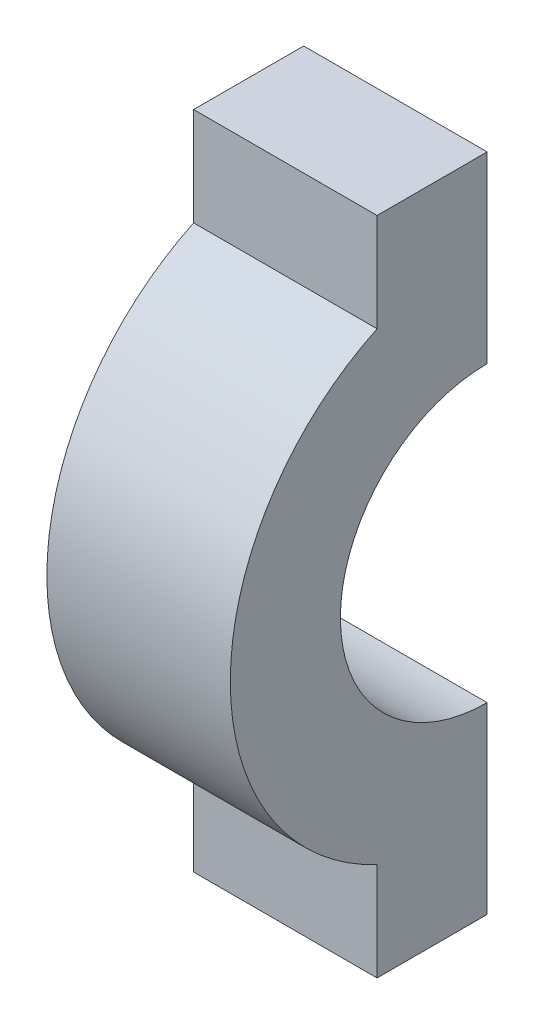
ISO-10303-21;
HEADER;
FILE_DESCRIPTION(('STEP AP214'),'2;1');
FILE_NAME('part.step','',(''),(''),'','','');
FILE_SCHEMA(('AUTOMOTIVE_DESIGN { 1 0 10303 214 1 1 1 1 }'));
ENDSEC;
DATA;
#1=APPLICATION_CONTEXT('core data for automotive mechanical design processes');
#2=APPLICATION_PROTOCOL_DEFINITION('international standard','automotive_design',2000,#1);
#3=PRODUCT_CONTEXT('',#1,'mechanical');
#4=PRODUCT('Part','Part','',(#3));
#5=PRODUCT_RELATED_PRODUCT_CATEGORY('part','',(#4));
#6=PRODUCT_DEFINITION_FORMATION('','',#4);
#7=PRODUCT_DEFINITION_CONTEXT('part definition',#1,'design');
#8=PRODUCT_DEFINITION('design','',#6,#7);
#9=PRODUCT_DEFINITION_SHAPE('','',#8);
#10=(LENGTH_UNIT() NAMED_UNIT(*) SI_UNIT(.MILLI.,.METRE.));
#11=(NAMED_UNIT(*) PLANE_ANGLE_UNIT() SI_UNIT($,.RADIAN.));
#12=(NAMED_UNIT(*) SI_UNIT($,.STERADIAN.) SOLID_ANGLE_UNIT());
#13=UNCERTAINTY_MEASURE_WITH_UNIT(LENGTH_MEASURE(1.E-05),#10,'distance_accuracy_value','');
#14=(GEOMETRIC_REPRESENTATION_CONTEXT(3) GLOBAL_UNCERTAINTY_ASSIGNED_CONTEXT((#13)) GLOBAL_UNIT_ASSIGNED_CONTEXT((#10,
#11,#12)) REPRESENTATION_CONTEXT('',''));
#15=CARTESIAN_POINT('',(0.,0.,0.));
#16=DIRECTION('',(0.,0.,1.));
#17=DIRECTION('',(1.,0.,0.));
#18=AXIS2_PLACEMENT_3D('',#15,#16,#17);
#19=CARTESIAN_POINT('',(15.,72.,18.));
#20=DIRECTION('',(-1.,0.,0.));
#21=DIRECTION('',(0.,0.,1.));
#22=AXIS2_PLACEMENT_3D('',#19,#20,#21);
#23=CYLINDRICAL_SURFACE('',#22,14.);
#24=CARTESIAN_POINT('',(5.,72.,18.));
#25=DIRECTION('',(1.,0.,0.));
#26=DIRECTION('',(0.,0.,-1.));
#27=AXIS2_PLACEMENT_3D('',#24,#25,#26);
#28=CIRCLE('',#27,14.);
#29=CARTESIAN_POINT('',(5.,84.6491106406735,24.));
#30=VERTEX_POINT('',#29);
#31=CARTESIAN_POINT('',(5.,59.3508893593265,24.));
#32=VERTEX_POINT('',#31);
#33=EDGE_CURVE('E131',#30,#32,#28,.T.);
#34=ORIENTED_EDGE('',*,*,#33,.T.);
#35=DIRECTION('',(-1.,0.,0.));
#36=VECTOR('',#35,1.);
#37=CARTESIAN_POINT('',(15.,59.3508893593265,24.));
#38=LINE('',#37,#36);
#39=CARTESIAN_POINT('',(15.,59.3508893593265,24.));
#40=VERTEX_POINT('',#39);
#41=EDGE_CURVE('E11',#40,#32,#38,.T.);
#42=ORIENTED_EDGE('',*,*,#41,.F.);
#43=CARTESIAN_POINT('',(15.,72.,18.));
#44=DIRECTION('',(1.,0.,0.));
#45=DIRECTION('',(0.,0.,-1.));
#46=AXIS2_PLACEMENT_3D('',#43,#44,#45);
#47=CIRCLE('',#46,14.);
#48=CARTESIAN_POINT('',(15.,84.6491106406735,24.));
#49=VERTEX_POINT('',#48);
#50=EDGE_CURVE('E145',#49,#40,#47,.T.);
#51=ORIENTED_EDGE('',*,*,#50,.F.);
#52=DIRECTION('',(-1.,0.,0.));
#53=VECTOR('',#52,1.);
#54=CARTESIAN_POINT('',(15.,84.6491106406735,24.));
#55=LINE('',#54,#53);
#56=EDGE_CURVE('E127',#49,#30,#55,.T.);
#57=ORIENTED_EDGE('',*,*,#56,.T.);
#58=EDGE_LOOP('',(#34,#42,#51,#57));
#59=FACE_BOUND('',#58,.T.);
#60=ADVANCED_FACE('F35',(#59),#23,.T.);
#61=CARTESIAN_POINT('',(15.,54.,24.));
#62=DIRECTION('',(0.,0.,-1.));
#63=DIRECTION('',(-1.,0.,0.));
#64=AXIS2_PLACEMENT_3D('',#61,#62,#63);
#65=PLANE('',#64);
#66=DIRECTION('',(0.,-1.,0.));
#67=VECTOR('',#66,1.);
#68=CARTESIAN_POINT('',(5.,54.,24.));
#69=LINE('',#68,#67);
#70=CARTESIAN_POINT('',(5.,54.,24.));
#71=VERTEX_POINT('',#70);
#72=EDGE_CURVE('E134',#32,#71,#69,.T.);
#73=ORIENTED_EDGE('',*,*,#72,.T.);
#74=DIRECTION('',(-1.,0.,0.));
#75=VECTOR('',#74,1.);
#76=CARTESIAN_POINT('',(15.,54.,24.));
#77=LINE('',#76,#75);
#78=CARTESIAN_POINT('',(15.,54.,24.));
#79=VERTEX_POINT('',#78);
#80=EDGE_CURVE('E43',#79,#71,#77,.T.);
#81=ORIENTED_EDGE('',*,*,#80,.F.);
#82=DIRECTION('',(0.,-1.,0.));
#83=VECTOR('',#82,1.);
#84=CARTESIAN_POINT('',(15.,54.,24.));
#85=LINE('',#84,#83);
#86=EDGE_CURVE('E94',#40,#79,#85,.T.);
#87=ORIENTED_EDGE('',*,*,#86,.F.);
#88=ORIENTED_EDGE('',*,*,#41,.T.);
#89=EDGE_LOOP('',(#73,#81,#87,#88));
#90=FACE_BOUND('',#89,.T.);
#91=ADVANCED_FACE('F180',(#90),#65,.F.);
#92=CARTESIAN_POINT('',(15.,54.,18.));
#93=DIRECTION('',(0.,1.,0.));
#94=DIRECTION('',(0.,0.,1.));
#95=AXIS2_PLACEMENT_3D('',#92,#93,#94);
#96=PLANE('',#95);
#97=DIRECTION('',(0.,0.,-1.));
#98=VECTOR('',#97,1.);
#99=CARTESIAN_POINT('',(5.,54.,18.));
#100=LINE('',#99,#98);
#101=CARTESIAN_POINT('',(5.,54.,18.));
#102=VERTEX_POINT('',#101);
#103=EDGE_CURVE('E136',#71,#102,#100,.T.);
#104=ORIENTED_EDGE('',*,*,#103,.T.);
#105=DIRECTION('',(-1.,0.,0.));
#106=VECTOR('',#105,1.);
#107=CARTESIAN_POINT('',(15.,54.,18.));
#108=LINE('',#107,#106);
#109=CARTESIAN_POINT('',(15.,54.,18.));
#110=VERTEX_POINT('',#109);
#111=EDGE_CURVE('E152',#110,#102,#108,.T.);
#112=ORIENTED_EDGE('',*,*,#111,.F.);
#113=DIRECTION('',(0.,0.,-1.));
#114=VECTOR('',#113,1.);
#115=CARTESIAN_POINT('',(15.,54.,18.));
#116=LINE('',#115,#114);
#117=EDGE_CURVE('E160',#79,#110,#116,.T.);
#118=ORIENTED_EDGE('',*,*,#117,.F.);
#119=ORIENTED_EDGE('',*,*,#80,.T.);
#120=EDGE_LOOP('',(#104,#112,#118,#119));
#121=FACE_BOUND('',#120,.T.);
#122=ADVANCED_FACE('F158',(#121),#96,.F.);
#123=CARTESIAN_POINT('',(15.,64.,18.));
#124=DIRECTION('',(0.,0.,1.));
#125=DIRECTION('',(0.,-1.,0.));
#126=AXIS2_PLACEMENT_3D('',#123,#124,#125);
#127=PLANE('',#126);
#128=DIRECTION('',(0.,1.,0.));
#129=VECTOR('',#128,1.);
#130=CARTESIAN_POINT('',(5.,64.,18.));
#131=LINE('',#130,#129);
#132=CARTESIAN_POINT('',(5.,64.,18.));
#133=VERTEX_POINT('',#132);
#134=EDGE_CURVE('E138',#102,#133,#131,.T.);
#135=ORIENTED_EDGE('',*,*,#134,.T.);
#136=DIRECTION('',(-1.,0.,0.));
#137=VECTOR('',#136,1.);
#138=CARTESIAN_POINT('',(15.,64.,18.));
#139=LINE('',#138,#137);
#140=CARTESIAN_POINT('',(15.,64.,18.));
#141=VERTEX_POINT('',#140);
#142=EDGE_CURVE('E149',#141,#133,#139,.T.);
#143=ORIENTED_EDGE('',*,*,#142,.F.);
#144=DIRECTION('',(0.,1.,0.));
#145=VECTOR('',#144,1.);
#146=CARTESIAN_POINT('',(15.,64.,18.));
#147=LINE('',#146,#145);
#148=EDGE_CURVE('E172',#110,#141,#147,.T.);
#149=ORIENTED_EDGE('',*,*,#148,.F.);
#150=ORIENTED_EDGE('',*,*,#111,.T.);
#151=EDGE_LOOP('',(#135,#143,#149,#150));
#152=FACE_BOUND('',#151,.T.);
#153=ADVANCED_FACE('F168',(#152),#127,.F.);
#154=CARTESIAN_POINT('',(15.,72.,18.));
#155=DIRECTION('',(-1.,0.,0.));
#156=DIRECTION('',(0.,0.,1.));
#157=AXIS2_PLACEMENT_3D('',#154,#155,#156);
#158=CYLINDRICAL_SURFACE('',#157,8.00000000000001);
#159=CARTESIAN_POINT('',(5.,72.,18.));
#160=DIRECTION('',(-1.,0.,0.));
#161=DIRECTION('',(0.,0.,-1.));
#162=AXIS2_PLACEMENT_3D('',#159,#160,#161);
#163=CIRCLE('',#162,8.00000000000001);
#164=CARTESIAN_POINT('',(5.,80.,18.));
#165=VERTEX_POINT('',#164);
#166=EDGE_CURVE('E140',#133,#165,#163,.T.);
#167=ORIENTED_EDGE('',*,*,#166,.T.);
#168=DIRECTION('',(-1.,0.,0.));
#169=VECTOR('',#168,1.);
#170=CARTESIAN_POINT('',(15.,80.,18.));
#171=LINE('',#170,#169);
#172=CARTESIAN_POINT('',(15.,80.,18.));
#173=VERTEX_POINT('',#172);
#174=EDGE_CURVE('E122',#173,#165,#171,.T.);
#175=ORIENTED_EDGE('',*,*,#174,.F.);
#176=CARTESIAN_POINT('',(15.,72.,18.));
#177=DIRECTION('',(-1.,0.,0.));
#178=DIRECTION('',(0.,0.,-1.));
#179=AXIS2_PLACEMENT_3D('',#176,#177,#178);
#180=CIRCLE('',#179,8.00000000000001);
#181=EDGE_CURVE('E113',#141,#173,#180,.T.);
#182=ORIENTED_EDGE('',*,*,#181,.F.);
#183=ORIENTED_EDGE('',*,*,#142,.T.);
#184=EDGE_LOOP('',(#167,#175,#182,#183));
#185=FACE_BOUND('',#184,.T.);
#186=ADVANCED_FACE('F171',(#185),#158,.F.);
#187=CARTESIAN_POINT('',(15.,80.,18.));
#188=DIRECTION('',(0.,0.,1.));
#189=DIRECTION('',(1.,0.,0.));
#190=AXIS2_PLACEMENT_3D('',#187,#188,#189);
#191=PLANE('',#190);
#192=DIRECTION('',(0.,1.,0.));
#193=VECTOR('',#192,1.);
#194=CARTESIAN_POINT('',(5.,80.,18.));
#195=LINE('',#194,#193);
#196=CARTESIAN_POINT('',(5.,90.,18.));
#197=VERTEX_POINT('',#196);
#198=EDGE_CURVE('E121',#165,#197,#195,.T.);
#199=ORIENTED_EDGE('',*,*,#198,.T.);
#200=DIRECTION('',(-1.,0.,0.));
#201=VECTOR('',#200,1.);
#202=CARTESIAN_POINT('',(15.,90.,18.));
#203=LINE('',#202,#201);
#204=CARTESIAN_POINT('',(15.,90.,18.));
#205=VERTEX_POINT('',#204);
#206=EDGE_CURVE('E118',#205,#197,#203,.T.);
#207=ORIENTED_EDGE('',*,*,#206,.F.);
#208=DIRECTION('',(0.,1.,0.));
#209=VECTOR('',#208,1.);
#210=CARTESIAN_POINT('',(15.,80.,18.));
#211=LINE('',#210,#209);
#212=EDGE_CURVE('E107',#173,#205,#211,.T.);
#213=ORIENTED_EDGE('',*,*,#212,.F.);
#214=ORIENTED_EDGE('',*,*,#174,.T.);
#215=EDGE_LOOP('',(#199,#207,#213,#214));
#216=FACE_BOUND('',#215,.T.);
#217=ADVANCED_FACE('F119',(#216),#191,.F.);
#218=CARTESIAN_POINT('',(15.,90.,18.));
#219=DIRECTION('',(0.,-1.,0.));
#220=DIRECTION('',(0.,0.,-1.));
#221=AXIS2_PLACEMENT_3D('',#218,#219,#220);
#222=PLANE('',#221);
#223=DIRECTION('',(0.,0.,1.));
#224=VECTOR('',#223,1.);
#225=CARTESIAN_POINT('',(5.,90.,18.));
#226=LINE('',#225,#224);
#227=CARTESIAN_POINT('',(5.,90.,24.));
#228=VERTEX_POINT('',#227);
#229=EDGE_CURVE('E80',#197,#228,#226,.T.);
#230=ORIENTED_EDGE('',*,*,#229,.T.);
#231=DIRECTION('',(-1.,0.,0.));
#232=VECTOR('',#231,1.);
#233=CARTESIAN_POINT('',(15.,90.,24.));
#234=LINE('',#233,#232);
#235=CARTESIAN_POINT('',(15.,90.,24.));
#236=VERTEX_POINT('',#235);
#237=EDGE_CURVE('E123',#236,#228,#234,.T.);
#238=ORIENTED_EDGE('',*,*,#237,.F.);
#239=DIRECTION('',(0.,0.,1.));
#240=VECTOR('',#239,1.);
#241=CARTESIAN_POINT('',(15.,90.,18.));
#242=LINE('',#241,#240);
#243=EDGE_CURVE('E111',#205,#236,#242,.T.);
#244=ORIENTED_EDGE('',*,*,#243,.F.);
#245=ORIENTED_EDGE('',*,*,#206,.T.);
#246=EDGE_LOOP('',(#230,#238,#244,#245));
#247=FACE_BOUND('',#246,.T.);
#248=ADVANCED_FACE('F125',(#247),#222,.F.);
#249=CARTESIAN_POINT('',(15.,90.,24.));
#250=DIRECTION('',(0.,0.,-1.));
#251=DIRECTION('',(0.,1.,0.));
#252=AXIS2_PLACEMENT_3D('',#249,#250,#251);
#253=PLANE('',#252);
#254=DIRECTION('',(0.,-1.,0.));
#255=VECTOR('',#254,1.);
#256=CARTESIAN_POINT('',(5.,90.,24.));
#257=LINE('',#256,#255);
#258=EDGE_CURVE('E86',#228,#30,#257,.T.);
#259=ORIENTED_EDGE('',*,*,#258,.T.);
#260=ORIENTED_EDGE('',*,*,#56,.F.);
#261=DIRECTION('',(0.,-1.,0.));
#262=VECTOR('',#261,1.);
#263=CARTESIAN_POINT('',(15.,90.,24.));
#264=LINE('',#263,#262);
#265=EDGE_CURVE('E51',#236,#49,#264,.T.);
#266=ORIENTED_EDGE('',*,*,#265,.F.);
#267=ORIENTED_EDGE('',*,*,#237,.T.);
#268=EDGE_LOOP('',(#259,#260,#266,#267));
#269=FACE_BOUND('',#268,.T.);
#270=ADVANCED_FACE('F196',(#269),#253,.F.);
#271=CARTESIAN_POINT('',(15.,72.,18.));
#272=DIRECTION('',(1.,0.,0.));
#273=DIRECTION('',(0.,0.,-1.));
#274=AXIS2_PLACEMENT_3D('',#271,#272,#273);
#275=PLANE('',#274);
#276=ORIENTED_EDGE('',*,*,#50,.T.);
#277=ORIENTED_EDGE('',*,*,#86,.T.);
#278=ORIENTED_EDGE('',*,*,#117,.T.);
#279=ORIENTED_EDGE('',*,*,#148,.T.);
#280=ORIENTED_EDGE('',*,*,#181,.T.);
#281=ORIENTED_EDGE('',*,*,#212,.T.);
#282=ORIENTED_EDGE('',*,*,#243,.T.);
#283=ORIENTED_EDGE('',*,*,#265,.T.);
#284=EDGE_LOOP('',(#276,#277,#278,#279,#280,#281,#282,#283));
#285=FACE_BOUND('',#284,.T.);
#286=ADVANCED_FACE('F109',(#285),#275,.T.);
#287=CARTESIAN_POINT('',(5.,72.,18.));
#288=DIRECTION('',(1.,0.,0.));
#289=DIRECTION('',(0.,0.,-1.));
#290=AXIS2_PLACEMENT_3D('',#287,#288,#289);
#291=PLANE('',#290);
#292=ORIENTED_EDGE('',*,*,#33,.F.);
#293=ORIENTED_EDGE('',*,*,#258,.F.);
#294=ORIENTED_EDGE('',*,*,#229,.F.);
#295=ORIENTED_EDGE('',*,*,#198,.F.);
#296=ORIENTED_EDGE('',*,*,#166,.F.);
#297=ORIENTED_EDGE('',*,*,#134,.F.);
#298=ORIENTED_EDGE('',*,*,#103,.F.);
#299=ORIENTED_EDGE('',*,*,#72,.F.);
#300=EDGE_LOOP('',(#292,#293,#294,#295,#296,#297,#298,#299));
#301=FACE_BOUND('',#300,.T.);
#302=ADVANCED_FACE('F164',(#301),#291,.F.);
#303=CLOSED_SHELL('',(#60,#91,#122,#153,#186,#217,#248,#270,#286,#302));
#304=MANIFOLD_SOLID_BREP('B2',#303);
#305=ADVANCED_BREP_SHAPE_REPRESENTATION('',(#18,#304),#14);
#306=SHAPE_DEFINITION_REPRESENTATION(#9,#305);
ENDSEC;
END-ISO-10303-21;
